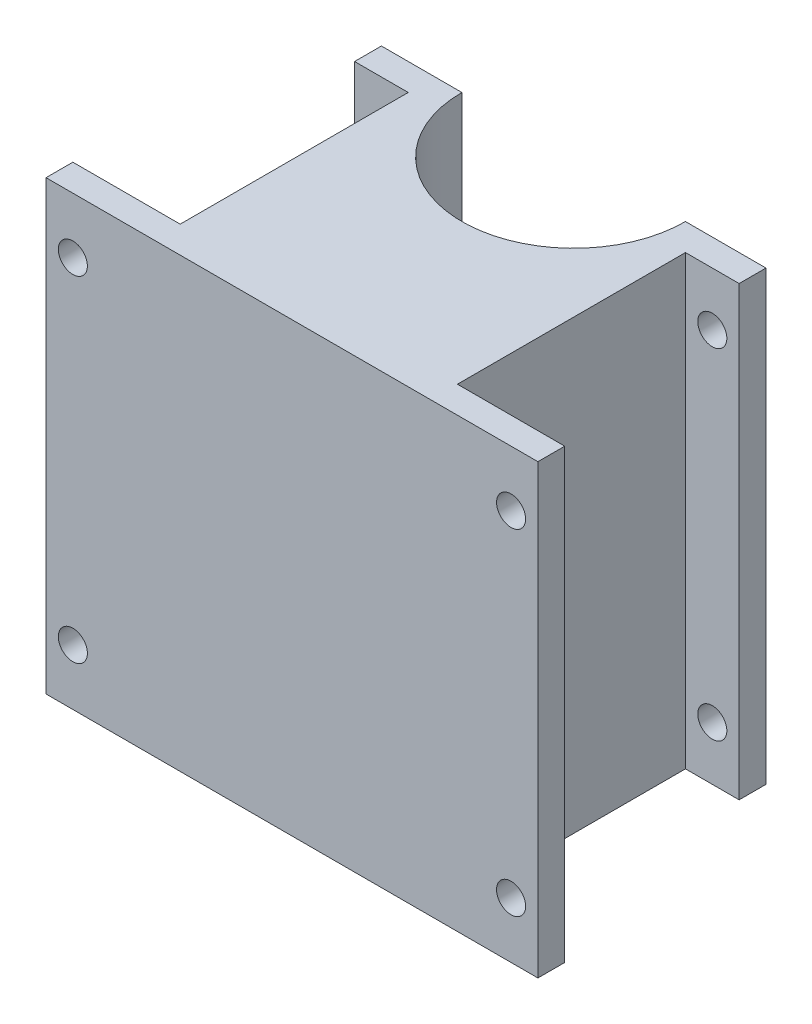
ISO-10303-21;
HEADER;
FILE_DESCRIPTION(('STEP AP214'),'2;1');
FILE_NAME('part.step','',(''),(''),'','','');
FILE_SCHEMA(('AUTOMOTIVE_DESIGN { 1 0 10303 214 1 1 1 1 }'));
ENDSEC;
DATA;
#1=APPLICATION_CONTEXT('core data for automotive mechanical design processes');
#2=APPLICATION_PROTOCOL_DEFINITION('international standard','automotive_design',2000,#1);
#3=PRODUCT_CONTEXT('',#1,'mechanical');
#4=PRODUCT('Part','Part','',(#3));
#5=PRODUCT_RELATED_PRODUCT_CATEGORY('part','',(#4));
#6=PRODUCT_DEFINITION_FORMATION('','',#4);
#7=PRODUCT_DEFINITION_CONTEXT('part definition',#1,'design');
#8=PRODUCT_DEFINITION('design','',#6,#7);
#9=PRODUCT_DEFINITION_SHAPE('','',#8);
#10=(LENGTH_UNIT() NAMED_UNIT(*) SI_UNIT(.MILLI.,.METRE.));
#11=(NAMED_UNIT(*) PLANE_ANGLE_UNIT() SI_UNIT($,.RADIAN.));
#12=(NAMED_UNIT(*) SI_UNIT($,.STERADIAN.) SOLID_ANGLE_UNIT());
#13=UNCERTAINTY_MEASURE_WITH_UNIT(LENGTH_MEASURE(1.E-05),#10,'distance_accuracy_value','');
#14=(GEOMETRIC_REPRESENTATION_CONTEXT(3) GLOBAL_UNCERTAINTY_ASSIGNED_CONTEXT((#13)) GLOBAL_UNIT_ASSIGNED_CONTEXT((#10,
#11,#12)) REPRESENTATION_CONTEXT('',''));
#15=CARTESIAN_POINT('',(0.,0.,0.));
#16=DIRECTION('',(0.,0.,1.));
#17=DIRECTION('',(1.,0.,0.));
#18=AXIS2_PLACEMENT_3D('',#15,#16,#17);
#19=CARTESIAN_POINT('',(31.,50.,-28.5));
#20=DIRECTION('',(0.,0.,-1.));
#21=DIRECTION('',(-1.,0.,0.));
#22=AXIS2_PLACEMENT_3D('',#19,#20,#21);
#23=PLANE('',#22);
#24=CARTESIAN_POINT('',(34.,44.,-28.5));
#25=DIRECTION('',(0.,0.,-1.));
#26=DIRECTION('',(-1.,0.,0.));
#27=AXIS2_PLACEMENT_3D('',#24,#25,#26);
#28=CIRCLE('',#27,1.625);
#29=CARTESIAN_POINT('',(32.375,44.,-28.5));
#30=VERTEX_POINT('',#29);
#31=EDGE_CURVE('E184',#30,#30,#28,.T.);
#32=ORIENTED_EDGE('',*,*,#31,.T.);
#33=EDGE_LOOP('',(#32));
#34=FACE_BOUND('',#33,.T.);
#35=CARTESIAN_POINT('',(34.,6.,-28.5));
#36=DIRECTION('',(0.,0.,-1.));
#37=DIRECTION('',(-1.,0.,0.));
#38=AXIS2_PLACEMENT_3D('',#35,#36,#37);
#39=CIRCLE('',#38,1.625);
#40=CARTESIAN_POINT('',(32.375,6.,-28.5));
#41=VERTEX_POINT('',#40);
#42=EDGE_CURVE('E270',#41,#41,#39,.T.);
#43=ORIENTED_EDGE('',*,*,#42,.T.);
#44=EDGE_LOOP('',(#43));
#45=FACE_BOUND('',#44,.T.);
#46=DIRECTION('',(1.,0.,0.));
#47=VECTOR('',#46,1.);
#48=CARTESIAN_POINT('',(31.,0.,-28.5));
#49=LINE('',#48,#47);
#50=CARTESIAN_POINT('',(31.,0.,-28.5));
#51=VERTEX_POINT('',#50);
#52=CARTESIAN_POINT('',(37.,0.,-28.5));
#53=VERTEX_POINT('',#52);
#54=EDGE_CURVE('E179',#51,#53,#49,.T.);
#55=ORIENTED_EDGE('',*,*,#54,.T.);
#56=DIRECTION('',(0.,-1.,0.));
#57=VECTOR('',#56,1.);
#58=CARTESIAN_POINT('',(37.,50.,-28.5));
#59=LINE('',#58,#57);
#60=CARTESIAN_POINT('',(37.,50.,-28.5));
#61=VERTEX_POINT('',#60);
#62=EDGE_CURVE('E11',#61,#53,#59,.T.);
#63=ORIENTED_EDGE('',*,*,#62,.F.);
#64=DIRECTION('',(1.,0.,0.));
#65=VECTOR('',#64,1.);
#66=CARTESIAN_POINT('',(31.,50.,-28.5));
#67=LINE('',#66,#65);
#68=CARTESIAN_POINT('',(31.,50.,-28.5));
#69=VERTEX_POINT('',#68);
#70=EDGE_CURVE('E220',#69,#61,#67,.T.);
#71=ORIENTED_EDGE('',*,*,#70,.F.);
#72=DIRECTION('',(0.,-1.,0.));
#73=VECTOR('',#72,1.);
#74=CARTESIAN_POINT('',(31.,50.,-28.5));
#75=LINE('',#74,#73);
#76=EDGE_CURVE('E175',#69,#51,#75,.T.);
#77=ORIENTED_EDGE('',*,*,#76,.T.);
#78=EDGE_LOOP('',(#55,#63,#71,#77));
#79=FACE_BOUND('',#78,.T.);
#80=ADVANCED_FACE('F40',(#34,#45,#79),#23,.F.);
#81=CARTESIAN_POINT('',(37.,50.,-28.5));
#82=DIRECTION('',(-1.,0.,0.));
#83=DIRECTION('',(0.,0.,1.));
#84=AXIS2_PLACEMENT_3D('',#81,#82,#83);
#85=PLANE('',#84);
#86=DIRECTION('',(0.,0.,-1.));
#87=VECTOR('',#86,1.);
#88=CARTESIAN_POINT('',(37.,0.,-28.5));
#89=LINE('',#88,#87);
#90=CARTESIAN_POINT('',(37.,0.,-31.5));
#91=VERTEX_POINT('',#90);
#92=EDGE_CURVE('E183',#53,#91,#89,.T.);
#93=ORIENTED_EDGE('',*,*,#92,.T.);
#94=DIRECTION('',(0.,-1.,0.));
#95=VECTOR('',#94,1.);
#96=CARTESIAN_POINT('',(37.,50.,-31.5));
#97=LINE('',#96,#95);
#98=CARTESIAN_POINT('',(37.,50.,-31.5));
#99=VERTEX_POINT('',#98);
#100=EDGE_CURVE('E50',#99,#91,#97,.T.);
#101=ORIENTED_EDGE('',*,*,#100,.F.);
#102=DIRECTION('',(0.,0.,-1.));
#103=VECTOR('',#102,1.);
#104=CARTESIAN_POINT('',(37.,50.,-28.5));
#105=LINE('',#104,#103);
#106=EDGE_CURVE('E120',#61,#99,#105,.T.);
#107=ORIENTED_EDGE('',*,*,#106,.F.);
#108=ORIENTED_EDGE('',*,*,#62,.T.);
#109=EDGE_LOOP('',(#93,#101,#107,#108));
#110=FACE_BOUND('',#109,.T.);
#111=ADVANCED_FACE('F370',(#110),#85,.F.);
#112=CARTESIAN_POINT('',(37.,50.,-31.5));
#113=DIRECTION('',(0.,0.,1.));
#114=DIRECTION('',(1.,0.,0.));
#115=AXIS2_PLACEMENT_3D('',#112,#113,#114);
#116=PLANE('',#115);
#117=CARTESIAN_POINT('',(34.,44.,-31.5));
#118=DIRECTION('',(0.,0.,-1.));
#119=DIRECTION('',(-1.,0.,0.));
#120=AXIS2_PLACEMENT_3D('',#117,#118,#119);
#121=CIRCLE('',#120,1.625);
#122=CARTESIAN_POINT('',(32.375,44.,-31.5));
#123=VERTEX_POINT('',#122);
#124=EDGE_CURVE('E296',#123,#123,#121,.T.);
#125=ORIENTED_EDGE('',*,*,#124,.F.);
#126=EDGE_LOOP('',(#125));
#127=FACE_BOUND('',#126,.T.);
#128=CARTESIAN_POINT('',(34.,6.,-31.5));
#129=DIRECTION('',(0.,0.,-1.));
#130=DIRECTION('',(-1.,0.,0.));
#131=AXIS2_PLACEMENT_3D('',#128,#129,#130);
#132=CIRCLE('',#131,1.625);
#133=CARTESIAN_POINT('',(32.375,6.,-31.5));
#134=VERTEX_POINT('',#133);
#135=EDGE_CURVE('E280',#134,#134,#132,.T.);
#136=ORIENTED_EDGE('',*,*,#135,.F.);
#137=EDGE_LOOP('',(#136));
#138=FACE_BOUND('',#137,.T.);
#139=DIRECTION('',(-1.,0.,0.));
#140=VECTOR('',#139,1.);
#141=CARTESIAN_POINT('',(37.,0.,-31.5));
#142=LINE('',#141,#140);
#143=CARTESIAN_POINT('',(28.,0.,-31.5));
#144=VERTEX_POINT('',#143);
#145=EDGE_CURVE('E187',#91,#144,#142,.T.);
#146=ORIENTED_EDGE('',*,*,#145,.T.);
#147=DIRECTION('',(0.,-1.,0.));
#148=VECTOR('',#147,1.);
#149=CARTESIAN_POINT('',(28.,50.,-31.5));
#150=LINE('',#149,#148);
#151=CARTESIAN_POINT('',(28.,50.,-31.5));
#152=VERTEX_POINT('',#151);
#153=EDGE_CURVE('E255',#152,#144,#150,.T.);
#154=ORIENTED_EDGE('',*,*,#153,.F.);
#155=DIRECTION('',(-1.,0.,0.));
#156=VECTOR('',#155,1.);
#157=CARTESIAN_POINT('',(37.,50.,-31.5));
#158=LINE('',#157,#156);
#159=EDGE_CURVE('E317',#99,#152,#158,.T.);
#160=ORIENTED_EDGE('',*,*,#159,.F.);
#161=ORIENTED_EDGE('',*,*,#100,.T.);
#162=EDGE_LOOP('',(#146,#154,#160,#161));
#163=FACE_BOUND('',#162,.T.);
#164=ADVANCED_FACE('F375',(#127,#138,#163),#116,.F.);
#165=CARTESIAN_POINT('',(15.5,50.,-31.5));
#166=DIRECTION('',(0.,-1.,0.));
#167=DIRECTION('',(0.,0.,-1.));
#168=AXIS2_PLACEMENT_3D('',#165,#166,#167);
#169=CYLINDRICAL_SURFACE('',#168,12.5);
#170=CARTESIAN_POINT('',(15.5,0.,-31.5));
#171=DIRECTION('',(0.,-1.,0.));
#172=DIRECTION('',(0.,0.,1.));
#173=AXIS2_PLACEMENT_3D('',#170,#171,#172);
#174=CIRCLE('',#173,12.5);
#175=CARTESIAN_POINT('',(3.,0.,-31.5));
#176=VERTEX_POINT('',#175);
#177=EDGE_CURVE('E190',#144,#176,#174,.T.);
#178=ORIENTED_EDGE('',*,*,#177,.T.);
#179=DIRECTION('',(0.,-1.,0.));
#180=VECTOR('',#179,1.);
#181=CARTESIAN_POINT('',(3.,50.,-31.5));
#182=LINE('',#181,#180);
#183=CARTESIAN_POINT('',(3.,50.,-31.5));
#184=VERTEX_POINT('',#183);
#185=EDGE_CURVE('E251',#184,#176,#182,.T.);
#186=ORIENTED_EDGE('',*,*,#185,.F.);
#187=CARTESIAN_POINT('',(15.5,50.,-31.5));
#188=DIRECTION('',(0.,-1.,0.));
#189=DIRECTION('',(0.,0.,1.));
#190=AXIS2_PLACEMENT_3D('',#187,#188,#189);
#191=CIRCLE('',#190,12.5);
#192=EDGE_CURVE('E320',#152,#184,#191,.T.);
#193=ORIENTED_EDGE('',*,*,#192,.F.);
#194=ORIENTED_EDGE('',*,*,#153,.T.);
#195=EDGE_LOOP('',(#178,#186,#193,#194));
#196=FACE_BOUND('',#195,.T.);
#197=ADVANCED_FACE('F439',(#196),#169,.F.);
#198=CARTESIAN_POINT('',(-6.,50.,-31.5));
#199=DIRECTION('',(0.,0.,1.));
#200=DIRECTION('',(1.,0.,0.));
#201=AXIS2_PLACEMENT_3D('',#198,#199,#200);
#202=PLANE('',#201);
#203=CARTESIAN_POINT('',(-3.,6.,-31.5));
#204=DIRECTION('',(0.,0.,-1.));
#205=DIRECTION('',(-1.,0.,0.));
#206=AXIS2_PLACEMENT_3D('',#203,#204,#205);
#207=CIRCLE('',#206,1.625);
#208=CARTESIAN_POINT('',(-4.625,6.,-31.5));
#209=VERTEX_POINT('',#208);
#210=EDGE_CURVE('E297',#209,#209,#207,.T.);
#211=ORIENTED_EDGE('',*,*,#210,.F.);
#212=EDGE_LOOP('',(#211));
#213=FACE_BOUND('',#212,.T.);
#214=CARTESIAN_POINT('',(-3.,44.,-31.5));
#215=DIRECTION('',(0.,0.,-1.));
#216=DIRECTION('',(-1.,0.,0.));
#217=AXIS2_PLACEMENT_3D('',#214,#215,#216);
#218=CIRCLE('',#217,1.625);
#219=CARTESIAN_POINT('',(-4.625,44.,-31.5));
#220=VERTEX_POINT('',#219);
#221=EDGE_CURVE('E267',#220,#220,#218,.T.);
#222=ORIENTED_EDGE('',*,*,#221,.F.);
#223=EDGE_LOOP('',(#222));
#224=FACE_BOUND('',#223,.T.);
#225=DIRECTION('',(-1.,0.,0.));
#226=VECTOR('',#225,1.);
#227=CARTESIAN_POINT('',(-6.,0.,-31.5));
#228=LINE('',#227,#226);
#229=CARTESIAN_POINT('',(-6.,0.,-31.5));
#230=VERTEX_POINT('',#229);
#231=EDGE_CURVE('E193',#176,#230,#228,.T.);
#232=ORIENTED_EDGE('',*,*,#231,.T.);
#233=DIRECTION('',(0.,-1.,0.));
#234=VECTOR('',#233,1.);
#235=CARTESIAN_POINT('',(-6.,50.,-31.5));
#236=LINE('',#235,#234);
#237=CARTESIAN_POINT('',(-6.,50.,-31.5));
#238=VERTEX_POINT('',#237);
#239=EDGE_CURVE('E247',#238,#230,#236,.T.);
#240=ORIENTED_EDGE('',*,*,#239,.F.);
#241=DIRECTION('',(-1.,0.,0.));
#242=VECTOR('',#241,1.);
#243=CARTESIAN_POINT('',(-6.,50.,-31.5));
#244=LINE('',#243,#242);
#245=EDGE_CURVE('E323',#184,#238,#244,.T.);
#246=ORIENTED_EDGE('',*,*,#245,.F.);
#247=ORIENTED_EDGE('',*,*,#185,.T.);
#248=EDGE_LOOP('',(#232,#240,#246,#247));
#249=FACE_BOUND('',#248,.T.);
#250=ADVANCED_FACE('F447',(#213,#224,#249),#202,.F.);
#251=CARTESIAN_POINT('',(-6.,50.,-28.5));
#252=DIRECTION('',(1.,0.,0.));
#253=DIRECTION('',(0.,0.,-1.));
#254=AXIS2_PLACEMENT_3D('',#251,#252,#253);
#255=PLANE('',#254);
#256=DIRECTION('',(0.,0.,1.));
#257=VECTOR('',#256,1.);
#258=CARTESIAN_POINT('',(-6.,0.,-28.5));
#259=LINE('',#258,#257);
#260=CARTESIAN_POINT('',(-6.,0.,-28.5));
#261=VERTEX_POINT('',#260);
#262=EDGE_CURVE('E196',#230,#261,#259,.T.);
#263=ORIENTED_EDGE('',*,*,#262,.T.);
#264=DIRECTION('',(0.,-1.,0.));
#265=VECTOR('',#264,1.);
#266=CARTESIAN_POINT('',(-6.,50.,-28.5));
#267=LINE('',#266,#265);
#268=CARTESIAN_POINT('',(-6.,50.,-28.5));
#269=VERTEX_POINT('',#268);
#270=EDGE_CURVE('E243',#269,#261,#267,.T.);
#271=ORIENTED_EDGE('',*,*,#270,.F.);
#272=DIRECTION('',(0.,0.,1.));
#273=VECTOR('',#272,1.);
#274=CARTESIAN_POINT('',(-6.,50.,-28.5));
#275=LINE('',#274,#273);
#276=EDGE_CURVE('E326',#238,#269,#275,.T.);
#277=ORIENTED_EDGE('',*,*,#276,.F.);
#278=ORIENTED_EDGE('',*,*,#239,.T.);
#279=EDGE_LOOP('',(#263,#271,#277,#278));
#280=FACE_BOUND('',#279,.T.);
#281=ADVANCED_FACE('F451',(#280),#255,.F.);
#282=CARTESIAN_POINT('',(-6.,50.,-28.5));
#283=DIRECTION('',(0.,0.,-1.));
#284=DIRECTION('',(-1.,0.,0.));
#285=AXIS2_PLACEMENT_3D('',#282,#283,#284);
#286=PLANE('',#285);
#287=CARTESIAN_POINT('',(-3.,6.,-28.5));
#288=DIRECTION('',(0.,0.,-1.));
#289=DIRECTION('',(-1.,0.,0.));
#290=AXIS2_PLACEMENT_3D('',#287,#288,#289);
#291=CIRCLE('',#290,1.625);
#292=CARTESIAN_POINT('',(-4.625,6.,-28.5));
#293=VERTEX_POINT('',#292);
#294=EDGE_CURVE('E266',#293,#293,#291,.T.);
#295=ORIENTED_EDGE('',*,*,#294,.T.);
#296=EDGE_LOOP('',(#295));
#297=FACE_BOUND('',#296,.T.);
#298=CARTESIAN_POINT('',(-3.,44.,-28.5));
#299=DIRECTION('',(0.,0.,-1.));
#300=DIRECTION('',(-1.,0.,0.));
#301=AXIS2_PLACEMENT_3D('',#298,#299,#300);
#302=CIRCLE('',#301,1.625);
#303=CARTESIAN_POINT('',(-4.625,44.,-28.5));
#304=VERTEX_POINT('',#303);
#305=EDGE_CURVE('E262',#304,#304,#302,.T.);
#306=ORIENTED_EDGE('',*,*,#305,.T.);
#307=EDGE_LOOP('',(#306));
#308=FACE_BOUND('',#307,.T.);
#309=DIRECTION('',(1.,0.,0.));
#310=VECTOR('',#309,1.);
#311=CARTESIAN_POINT('',(-6.,0.,-28.5));
#312=LINE('',#311,#310);
#313=CARTESIAN_POINT('',(0.,0.,-28.5));
#314=VERTEX_POINT('',#313);
#315=EDGE_CURVE('E199',#261,#314,#312,.T.);
#316=ORIENTED_EDGE('',*,*,#315,.T.);
#317=DIRECTION('',(0.,-1.,0.));
#318=VECTOR('',#317,1.);
#319=CARTESIAN_POINT('',(0.,50.,-28.5));
#320=LINE('',#319,#318);
#321=CARTESIAN_POINT('',(0.,50.,-28.5));
#322=VERTEX_POINT('',#321);
#323=EDGE_CURVE('E239',#322,#314,#320,.T.);
#324=ORIENTED_EDGE('',*,*,#323,.F.);
#325=DIRECTION('',(1.,0.,0.));
#326=VECTOR('',#325,1.);
#327=CARTESIAN_POINT('',(-6.,50.,-28.5));
#328=LINE('',#327,#326);
#329=EDGE_CURVE('E329',#269,#322,#328,.T.);
#330=ORIENTED_EDGE('',*,*,#329,.F.);
#331=ORIENTED_EDGE('',*,*,#270,.T.);
#332=EDGE_LOOP('',(#316,#324,#330,#331));
#333=FACE_BOUND('',#332,.T.);
#334=ADVANCED_FACE('F459',(#297,#308,#333),#286,.F.);
#335=CARTESIAN_POINT('',(0.,50.,-28.5));
#336=DIRECTION('',(1.,0.,0.));
#337=DIRECTION('',(0.,0.,-1.));
#338=AXIS2_PLACEMENT_3D('',#335,#336,#337);
#339=PLANE('',#338);
#340=DIRECTION('',(0.,0.,1.));
#341=VECTOR('',#340,1.);
#342=CARTESIAN_POINT('',(0.,0.,-28.5));
#343=LINE('',#342,#341);
#344=CARTESIAN_POINT('',(0.,0.,-3.));
#345=VERTEX_POINT('',#344);
#346=EDGE_CURVE('E202',#314,#345,#343,.T.);
#347=ORIENTED_EDGE('',*,*,#346,.T.);
#348=DIRECTION('',(0.,-1.,0.));
#349=VECTOR('',#348,1.);
#350=CARTESIAN_POINT('',(0.,50.,-3.));
#351=LINE('',#350,#349);
#352=CARTESIAN_POINT('',(0.,50.,-3.));
#353=VERTEX_POINT('',#352);
#354=EDGE_CURVE('E235',#353,#345,#351,.T.);
#355=ORIENTED_EDGE('',*,*,#354,.F.);
#356=DIRECTION('',(0.,0.,1.));
#357=VECTOR('',#356,1.);
#358=CARTESIAN_POINT('',(0.,50.,-28.5));
#359=LINE('',#358,#357);
#360=EDGE_CURVE('E332',#322,#353,#359,.T.);
#361=ORIENTED_EDGE('',*,*,#360,.F.);
#362=ORIENTED_EDGE('',*,*,#323,.T.);
#363=EDGE_LOOP('',(#347,#355,#361,#362));
#364=FACE_BOUND('',#363,.T.);
#365=ADVANCED_FACE('F463',(#364),#339,.F.);
#366=CARTESIAN_POINT('',(0.,50.,-3.));
#367=DIRECTION('',(0.,0.,1.));
#368=DIRECTION('',(1.,0.,0.));
#369=AXIS2_PLACEMENT_3D('',#366,#367,#368);
#370=PLANE('',#369);
#371=CARTESIAN_POINT('',(-9.,6.25,-3.));
#372=DIRECTION('',(0.,0.,-1.));
#373=DIRECTION('',(-1.,0.,0.));
#374=AXIS2_PLACEMENT_3D('',#371,#372,#373);
#375=CIRCLE('',#374,1.625);
#376=CARTESIAN_POINT('',(-10.625,6.25,-3.));
#377=VERTEX_POINT('',#376);
#378=EDGE_CURVE('E274',#377,#377,#375,.T.);
#379=ORIENTED_EDGE('',*,*,#378,.F.);
#380=EDGE_LOOP('',(#379));
#381=FACE_BOUND('',#380,.T.);
#382=CARTESIAN_POINT('',(-9.,43.75,-3.));
#383=DIRECTION('',(0.,0.,-1.));
#384=DIRECTION('',(-1.,0.,0.));
#385=AXIS2_PLACEMENT_3D('',#382,#383,#384);
#386=CIRCLE('',#385,1.625);
#387=CARTESIAN_POINT('',(-10.625,43.75,-3.));
#388=VERTEX_POINT('',#387);
#389=EDGE_CURVE('E282',#388,#388,#386,.T.);
#390=ORIENTED_EDGE('',*,*,#389,.F.);
#391=EDGE_LOOP('',(#390));
#392=FACE_BOUND('',#391,.T.);
#393=DIRECTION('',(-1.,0.,0.));
#394=VECTOR('',#393,1.);
#395=CARTESIAN_POINT('',(0.,0.,-3.));
#396=LINE('',#395,#394);
#397=CARTESIAN_POINT('',(-12.,0.,-3.));
#398=VERTEX_POINT('',#397);
#399=EDGE_CURVE('E205',#345,#398,#396,.T.);
#400=ORIENTED_EDGE('',*,*,#399,.T.);
#401=DIRECTION('',(0.,-1.,0.));
#402=VECTOR('',#401,1.);
#403=CARTESIAN_POINT('',(-12.,50.,-3.));
#404=LINE('',#403,#402);
#405=CARTESIAN_POINT('',(-12.,50.,-3.));
#406=VERTEX_POINT('',#405);
#407=EDGE_CURVE('E231',#406,#398,#404,.T.);
#408=ORIENTED_EDGE('',*,*,#407,.F.);
#409=DIRECTION('',(-1.,0.,0.));
#410=VECTOR('',#409,1.);
#411=CARTESIAN_POINT('',(0.,50.,-3.));
#412=LINE('',#411,#410);
#413=EDGE_CURVE('E335',#353,#406,#412,.T.);
#414=ORIENTED_EDGE('',*,*,#413,.F.);
#415=ORIENTED_EDGE('',*,*,#354,.T.);
#416=EDGE_LOOP('',(#400,#408,#414,#415));
#417=FACE_BOUND('',#416,.T.);
#418=ADVANCED_FACE('F488',(#381,#392,#417),#370,.F.);
#419=CARTESIAN_POINT('',(-12.,50.,-3.));
#420=DIRECTION('',(1.,0.,0.));
#421=DIRECTION('',(0.,0.,-1.));
#422=AXIS2_PLACEMENT_3D('',#419,#420,#421);
#423=PLANE('',#422);
#424=DIRECTION('',(0.,0.,1.));
#425=VECTOR('',#424,1.);
#426=CARTESIAN_POINT('',(-12.,0.,-3.));
#427=LINE('',#426,#425);
#428=CARTESIAN_POINT('',(-12.,0.,0.));
#429=VERTEX_POINT('',#428);
#430=EDGE_CURVE('E208',#398,#429,#427,.T.);
#431=ORIENTED_EDGE('',*,*,#430,.T.);
#432=DIRECTION('',(0.,-1.,0.));
#433=VECTOR('',#432,1.);
#434=CARTESIAN_POINT('',(-12.,50.,0.));
#435=LINE('',#434,#433);
#436=CARTESIAN_POINT('',(-12.,50.,0.));
#437=VERTEX_POINT('',#436);
#438=EDGE_CURVE('E227',#437,#429,#435,.T.);
#439=ORIENTED_EDGE('',*,*,#438,.F.);
#440=DIRECTION('',(0.,0.,1.));
#441=VECTOR('',#440,1.);
#442=CARTESIAN_POINT('',(-12.,50.,-3.));
#443=LINE('',#442,#441);
#444=EDGE_CURVE('E338',#406,#437,#443,.T.);
#445=ORIENTED_EDGE('',*,*,#444,.F.);
#446=ORIENTED_EDGE('',*,*,#407,.T.);
#447=EDGE_LOOP('',(#431,#439,#445,#446));
#448=FACE_BOUND('',#447,.T.);
#449=ADVANCED_FACE('F346',(#448),#423,.F.);
#450=CARTESIAN_POINT('',(-12.,50.,0.));
#451=DIRECTION('',(0.,0.,-1.));
#452=DIRECTION('',(-1.,0.,0.));
#453=AXIS2_PLACEMENT_3D('',#450,#451,#452);
#454=PLANE('',#453);
#455=CARTESIAN_POINT('',(40.,6.25,0.));
#456=DIRECTION('',(0.,0.,-1.));
#457=DIRECTION('',(-1.,0.,0.));
#458=AXIS2_PLACEMENT_3D('',#455,#456,#457);
#459=CIRCLE('',#458,1.625);
#460=CARTESIAN_POINT('',(38.375,6.25,0.));
#461=VERTEX_POINT('',#460);
#462=EDGE_CURVE('E288',#461,#461,#459,.T.);
#463=ORIENTED_EDGE('',*,*,#462,.T.);
#464=EDGE_LOOP('',(#463));
#465=FACE_BOUND('',#464,.T.);
#466=CARTESIAN_POINT('',(40.,43.75,0.));
#467=DIRECTION('',(0.,0.,-1.));
#468=DIRECTION('',(-1.,0.,0.));
#469=AXIS2_PLACEMENT_3D('',#466,#467,#468);
#470=CIRCLE('',#469,1.625);
#471=CARTESIAN_POINT('',(38.375,43.75,0.));
#472=VERTEX_POINT('',#471);
#473=EDGE_CURVE('E662',#472,#472,#470,.T.);
#474=ORIENTED_EDGE('',*,*,#473,.T.);
#475=EDGE_LOOP('',(#474));
#476=FACE_BOUND('',#475,.T.);
#477=CARTESIAN_POINT('',(-9.,6.25,0.));
#478=DIRECTION('',(0.,0.,-1.));
#479=DIRECTION('',(-1.,0.,0.));
#480=AXIS2_PLACEMENT_3D('',#477,#478,#479);
#481=CIRCLE('',#480,1.625);
#482=CARTESIAN_POINT('',(-10.625,6.25,0.));
#483=VERTEX_POINT('',#482);
#484=EDGE_CURVE('E43',#483,#483,#481,.T.);
#485=ORIENTED_EDGE('',*,*,#484,.T.);
#486=EDGE_LOOP('',(#485));
#487=FACE_BOUND('',#486,.T.);
#488=CARTESIAN_POINT('',(-9.,43.75,0.));
#489=DIRECTION('',(0.,0.,-1.));
#490=DIRECTION('',(-1.,0.,0.));
#491=AXIS2_PLACEMENT_3D('',#488,#489,#490);
#492=CIRCLE('',#491,1.625);
#493=CARTESIAN_POINT('',(-10.625,43.75,0.));
#494=VERTEX_POINT('',#493);
#495=EDGE_CURVE('E271',#494,#494,#492,.T.);
#496=ORIENTED_EDGE('',*,*,#495,.T.);
#497=EDGE_LOOP('',(#496));
#498=FACE_BOUND('',#497,.T.);
#499=DIRECTION('',(1.,0.,0.));
#500=VECTOR('',#499,1.);
#501=CARTESIAN_POINT('',(-12.,0.,0.));
#502=LINE('',#501,#500);
#503=CARTESIAN_POINT('',(43.,0.,0.));
#504=VERTEX_POINT('',#503);
#505=EDGE_CURVE('E211',#429,#504,#502,.T.);
#506=ORIENTED_EDGE('',*,*,#505,.T.);
#507=DIRECTION('',(0.,-1.,0.));
#508=VECTOR('',#507,1.);
#509=CARTESIAN_POINT('',(43.,50.,0.));
#510=LINE('',#509,#508);
#511=CARTESIAN_POINT('',(43.,50.,0.));
#512=VERTEX_POINT('',#511);
#513=EDGE_CURVE('E168',#512,#504,#510,.T.);
#514=ORIENTED_EDGE('',*,*,#513,.F.);
#515=DIRECTION('',(1.,0.,0.));
#516=VECTOR('',#515,1.);
#517=CARTESIAN_POINT('',(-12.,50.,0.));
#518=LINE('',#517,#516);
#519=EDGE_CURVE('E157',#437,#512,#518,.T.);
#520=ORIENTED_EDGE('',*,*,#519,.F.);
#521=ORIENTED_EDGE('',*,*,#438,.T.);
#522=EDGE_LOOP('',(#506,#514,#520,#521));
#523=FACE_BOUND('',#522,.T.);
#524=ADVANCED_FACE('F350',(#465,#476,#487,#498,#523),#454,.F.);
#525=CARTESIAN_POINT('',(43.,50.,0.));
#526=DIRECTION('',(-1.,0.,0.));
#527=DIRECTION('',(0.,0.,1.));
#528=AXIS2_PLACEMENT_3D('',#525,#526,#527);
#529=PLANE('',#528);
#530=DIRECTION('',(0.,0.,-1.));
#531=VECTOR('',#530,1.);
#532=CARTESIAN_POINT('',(43.,0.,0.));
#533=LINE('',#532,#531);
#534=CARTESIAN_POINT('',(43.,0.,-3.));
#535=VERTEX_POINT('',#534);
#536=EDGE_CURVE('E166',#504,#535,#533,.T.);
#537=ORIENTED_EDGE('',*,*,#536,.T.);
#538=DIRECTION('',(0.,-1.,0.));
#539=VECTOR('',#538,1.);
#540=CARTESIAN_POINT('',(43.,50.,-3.));
#541=LINE('',#540,#539);
#542=CARTESIAN_POINT('',(43.,50.,-3.));
#543=VERTEX_POINT('',#542);
#544=EDGE_CURVE('E163',#543,#535,#541,.T.);
#545=ORIENTED_EDGE('',*,*,#544,.F.);
#546=DIRECTION('',(0.,0.,-1.));
#547=VECTOR('',#546,1.);
#548=CARTESIAN_POINT('',(43.,50.,0.));
#549=LINE('',#548,#547);
#550=EDGE_CURVE('E151',#512,#543,#549,.T.);
#551=ORIENTED_EDGE('',*,*,#550,.F.);
#552=ORIENTED_EDGE('',*,*,#513,.T.);
#553=EDGE_LOOP('',(#537,#545,#551,#552));
#554=FACE_BOUND('',#553,.T.);
#555=ADVANCED_FACE('F164',(#554),#529,.F.);
#556=CARTESIAN_POINT('',(43.,50.,-3.));
#557=DIRECTION('',(0.,0.,1.));
#558=DIRECTION('',(1.,0.,0.));
#559=AXIS2_PLACEMENT_3D('',#556,#557,#558);
#560=PLANE('',#559);
#561=CARTESIAN_POINT('',(40.,6.25,-3.));
#562=DIRECTION('',(0.,0.,-1.));
#563=DIRECTION('',(-1.,0.,0.));
#564=AXIS2_PLACEMENT_3D('',#561,#562,#563);
#565=CIRCLE('',#564,1.625);
#566=CARTESIAN_POINT('',(38.375,6.25,-3.));
#567=VERTEX_POINT('',#566);
#568=EDGE_CURVE('E667',#567,#567,#565,.T.);
#569=ORIENTED_EDGE('',*,*,#568,.F.);
#570=EDGE_LOOP('',(#569));
#571=FACE_BOUND('',#570,.T.);
#572=CARTESIAN_POINT('',(40.,43.75,-3.));
#573=DIRECTION('',(0.,0.,-1.));
#574=DIRECTION('',(-1.,0.,0.));
#575=AXIS2_PLACEMENT_3D('',#572,#573,#574);
#576=CIRCLE('',#575,1.625);
#577=CARTESIAN_POINT('',(38.375,43.75,-3.));
#578=VERTEX_POINT('',#577);
#579=EDGE_CURVE('E671',#578,#578,#576,.T.);
#580=ORIENTED_EDGE('',*,*,#579,.F.);
#581=EDGE_LOOP('',(#580));
#582=FACE_BOUND('',#581,.T.);
#583=DIRECTION('',(-1.,0.,0.));
#584=VECTOR('',#583,1.);
#585=CARTESIAN_POINT('',(43.,0.,-3.));
#586=LINE('',#585,#584);
#587=CARTESIAN_POINT('',(31.,0.,-3.));
#588=VERTEX_POINT('',#587);
#589=EDGE_CURVE('E106',#535,#588,#586,.T.);
#590=ORIENTED_EDGE('',*,*,#589,.T.);
#591=DIRECTION('',(0.,-1.,0.));
#592=VECTOR('',#591,1.);
#593=CARTESIAN_POINT('',(31.,50.,-3.));
#594=LINE('',#593,#592);
#595=CARTESIAN_POINT('',(31.,50.,-3.));
#596=VERTEX_POINT('',#595);
#597=EDGE_CURVE('E169',#596,#588,#594,.T.);
#598=ORIENTED_EDGE('',*,*,#597,.F.);
#599=DIRECTION('',(-1.,0.,0.));
#600=VECTOR('',#599,1.);
#601=CARTESIAN_POINT('',(43.,50.,-3.));
#602=LINE('',#601,#600);
#603=EDGE_CURVE('E155',#543,#596,#602,.T.);
#604=ORIENTED_EDGE('',*,*,#603,.F.);
#605=ORIENTED_EDGE('',*,*,#544,.T.);
#606=EDGE_LOOP('',(#590,#598,#604,#605));
#607=FACE_BOUND('',#606,.T.);
#608=ADVANCED_FACE('F171',(#571,#582,#607),#560,.F.);
#609=CARTESIAN_POINT('',(31.,50.,-3.));
#610=DIRECTION('',(-1.,0.,0.));
#611=DIRECTION('',(0.,0.,1.));
#612=AXIS2_PLACEMENT_3D('',#609,#610,#611);
#613=PLANE('',#612);
#614=DIRECTION('',(0.,0.,-1.));
#615=VECTOR('',#614,1.);
#616=CARTESIAN_POINT('',(31.,0.,-3.));
#617=LINE('',#616,#615);
#618=EDGE_CURVE('E112',#588,#51,#617,.T.);
#619=ORIENTED_EDGE('',*,*,#618,.T.);
#620=ORIENTED_EDGE('',*,*,#76,.F.);
#621=DIRECTION('',(0.,0.,-1.));
#622=VECTOR('',#621,1.);
#623=CARTESIAN_POINT('',(31.,50.,-3.));
#624=LINE('',#623,#622);
#625=EDGE_CURVE('E59',#596,#69,#624,.T.);
#626=ORIENTED_EDGE('',*,*,#625,.F.);
#627=ORIENTED_EDGE('',*,*,#597,.T.);
#628=EDGE_LOOP('',(#619,#620,#626,#627));
#629=FACE_BOUND('',#628,.T.);
#630=ADVANCED_FACE('F358',(#629),#613,.F.);
#631=CARTESIAN_POINT('',(15.5,50.,-31.5));
#632=DIRECTION('',(0.,1.,0.));
#633=DIRECTION('',(0.,0.,1.));
#634=AXIS2_PLACEMENT_3D('',#631,#632,#633);
#635=PLANE('',#634);
#636=ORIENTED_EDGE('',*,*,#70,.T.);
#637=ORIENTED_EDGE('',*,*,#106,.T.);
#638=ORIENTED_EDGE('',*,*,#159,.T.);
#639=ORIENTED_EDGE('',*,*,#192,.T.);
#640=ORIENTED_EDGE('',*,*,#245,.T.);
#641=ORIENTED_EDGE('',*,*,#276,.T.);
#642=ORIENTED_EDGE('',*,*,#329,.T.);
#643=ORIENTED_EDGE('',*,*,#360,.T.);
#644=ORIENTED_EDGE('',*,*,#413,.T.);
#645=ORIENTED_EDGE('',*,*,#444,.T.);
#646=ORIENTED_EDGE('',*,*,#519,.T.);
#647=ORIENTED_EDGE('',*,*,#550,.T.);
#648=ORIENTED_EDGE('',*,*,#603,.T.);
#649=ORIENTED_EDGE('',*,*,#625,.T.);
#650=EDGE_LOOP('',(#636,#637,#638,#639,#640,#641,#642,#643,#644,#645,#646,#647,#648,#649));
#651=FACE_BOUND('',#650,.T.);
#652=ADVANCED_FACE('F153',(#651),#635,.T.);
#653=CARTESIAN_POINT('',(15.5,0.,-31.5));
#654=DIRECTION('',(0.,1.,0.));
#655=DIRECTION('',(0.,0.,1.));
#656=AXIS2_PLACEMENT_3D('',#653,#654,#655);
#657=PLANE('',#656);
#658=ORIENTED_EDGE('',*,*,#54,.F.);
#659=ORIENTED_EDGE('',*,*,#618,.F.);
#660=ORIENTED_EDGE('',*,*,#589,.F.);
#661=ORIENTED_EDGE('',*,*,#536,.F.);
#662=ORIENTED_EDGE('',*,*,#505,.F.);
#663=ORIENTED_EDGE('',*,*,#430,.F.);
#664=ORIENTED_EDGE('',*,*,#399,.F.);
#665=ORIENTED_EDGE('',*,*,#346,.F.);
#666=ORIENTED_EDGE('',*,*,#315,.F.);
#667=ORIENTED_EDGE('',*,*,#262,.F.);
#668=ORIENTED_EDGE('',*,*,#231,.F.);
#669=ORIENTED_EDGE('',*,*,#177,.F.);
#670=ORIENTED_EDGE('',*,*,#145,.F.);
#671=ORIENTED_EDGE('',*,*,#92,.F.);
#672=EDGE_LOOP('',(#658,#659,#660,#661,#662,#663,#664,#665,#666,#667,#668,#669,#670,#671));
#673=FACE_BOUND('',#672,.T.);
#674=ADVANCED_FACE('F353',(#673),#657,.F.);
#675=CARTESIAN_POINT('',(-3.,44.,-25.5));
#676=DIRECTION('',(0.,0.,-1.));
#677=DIRECTION('',(-1.,0.,0.));
#678=AXIS2_PLACEMENT_3D('',#675,#676,#677);
#679=CYLINDRICAL_SURFACE('',#678,1.625);
#680=ORIENTED_EDGE('',*,*,#221,.T.);
#681=EDGE_LOOP('',(#680));
#682=FACE_BOUND('',#681,.T.);
#683=ORIENTED_EDGE('',*,*,#305,.F.);
#684=EDGE_LOOP('',(#683));
#685=FACE_BOUND('',#684,.T.);
#686=ADVANCED_FACE('F393',(#682,#685),#679,.F.);
#687=CARTESIAN_POINT('',(-3.,6.,-25.5));
#688=DIRECTION('',(0.,0.,-1.));
#689=DIRECTION('',(-1.,0.,0.));
#690=AXIS2_PLACEMENT_3D('',#687,#688,#689);
#691=CYLINDRICAL_SURFACE('',#690,1.625);
#692=ORIENTED_EDGE('',*,*,#210,.T.);
#693=EDGE_LOOP('',(#692));
#694=FACE_BOUND('',#693,.T.);
#695=ORIENTED_EDGE('',*,*,#294,.F.);
#696=EDGE_LOOP('',(#695));
#697=FACE_BOUND('',#696,.T.);
#698=ADVANCED_FACE('F383',(#694,#697),#691,.F.);
#699=CARTESIAN_POINT('',(34.,6.,-25.5));
#700=DIRECTION('',(0.,0.,-1.));
#701=DIRECTION('',(-1.,0.,0.));
#702=AXIS2_PLACEMENT_3D('',#699,#700,#701);
#703=CYLINDRICAL_SURFACE('',#702,1.625);
#704=ORIENTED_EDGE('',*,*,#135,.T.);
#705=EDGE_LOOP('',(#704));
#706=FACE_BOUND('',#705,.T.);
#707=ORIENTED_EDGE('',*,*,#42,.F.);
#708=EDGE_LOOP('',(#707));
#709=FACE_BOUND('',#708,.T.);
#710=ADVANCED_FACE('F380',(#706,#709),#703,.F.);
#711=CARTESIAN_POINT('',(34.,44.,-25.5));
#712=DIRECTION('',(0.,0.,-1.));
#713=DIRECTION('',(-1.,0.,0.));
#714=AXIS2_PLACEMENT_3D('',#711,#712,#713);
#715=CYLINDRICAL_SURFACE('',#714,1.625);
#716=ORIENTED_EDGE('',*,*,#124,.T.);
#717=EDGE_LOOP('',(#716));
#718=FACE_BOUND('',#717,.T.);
#719=ORIENTED_EDGE('',*,*,#31,.F.);
#720=EDGE_LOOP('',(#719));
#721=FACE_BOUND('',#720,.T.);
#722=ADVANCED_FACE('F382',(#718,#721),#715,.F.);
#723=CARTESIAN_POINT('',(-9.,43.75,11.));
#724=DIRECTION('',(0.,0.,-1.));
#725=DIRECTION('',(-1.,0.,0.));
#726=AXIS2_PLACEMENT_3D('',#723,#724,#725);
#727=CYLINDRICAL_SURFACE('',#726,1.625);
#728=ORIENTED_EDGE('',*,*,#389,.T.);
#729=EDGE_LOOP('',(#728));
#730=FACE_BOUND('',#729,.T.);
#731=ORIENTED_EDGE('',*,*,#495,.F.);
#732=EDGE_LOOP('',(#731));
#733=FACE_BOUND('',#732,.T.);
#734=ADVANCED_FACE('F390',(#730,#733),#727,.F.);
#735=CARTESIAN_POINT('',(-9.,6.25,11.));
#736=DIRECTION('',(0.,0.,-1.));
#737=DIRECTION('',(-1.,0.,0.));
#738=AXIS2_PLACEMENT_3D('',#735,#736,#737);
#739=CYLINDRICAL_SURFACE('',#738,1.625);
#740=ORIENTED_EDGE('',*,*,#378,.T.);
#741=EDGE_LOOP('',(#740));
#742=FACE_BOUND('',#741,.T.);
#743=ORIENTED_EDGE('',*,*,#484,.F.);
#744=EDGE_LOOP('',(#743));
#745=FACE_BOUND('',#744,.T.);
#746=ADVANCED_FACE('F473',(#742,#745),#739,.F.);
#747=CARTESIAN_POINT('',(40.,43.75,11.));
#748=DIRECTION('',(0.,0.,-1.));
#749=DIRECTION('',(-1.,0.,0.));
#750=AXIS2_PLACEMENT_3D('',#747,#748,#749);
#751=CYLINDRICAL_SURFACE('',#750,1.625);
#752=ORIENTED_EDGE('',*,*,#579,.T.);
#753=EDGE_LOOP('',(#752));
#754=FACE_BOUND('',#753,.T.);
#755=ORIENTED_EDGE('',*,*,#473,.F.);
#756=EDGE_LOOP('',(#755));
#757=FACE_BOUND('',#756,.T.);
#758=ADVANCED_FACE('F482',(#754,#757),#751,.F.);
#759=CARTESIAN_POINT('',(40.,6.25,11.));
#760=DIRECTION('',(0.,0.,-1.));
#761=DIRECTION('',(-1.,0.,0.));
#762=AXIS2_PLACEMENT_3D('',#759,#760,#761);
#763=CYLINDRICAL_SURFACE('',#762,1.625);
#764=ORIENTED_EDGE('',*,*,#568,.T.);
#765=EDGE_LOOP('',(#764));
#766=FACE_BOUND('',#765,.T.);
#767=ORIENTED_EDGE('',*,*,#462,.F.);
#768=EDGE_LOOP('',(#767));
#769=FACE_BOUND('',#768,.T.);
#770=ADVANCED_FACE('F501',(#766,#769),#763,.F.);
#771=CLOSED_SHELL('',(#80,#111,#164,#197,#250,#281,#334,#365,#418,#449,#524,#555,#608,#630,#652,
#674,#686,#698,#710,#722,#734,#746,#758,#770));
#772=MANIFOLD_SOLID_BREP('B2',#771);
#773=ADVANCED_BREP_SHAPE_REPRESENTATION('',(#18,#772),#14);
#774=SHAPE_DEFINITION_REPRESENTATION(#9,#773);
ENDSEC;
END-ISO-10303-21;
